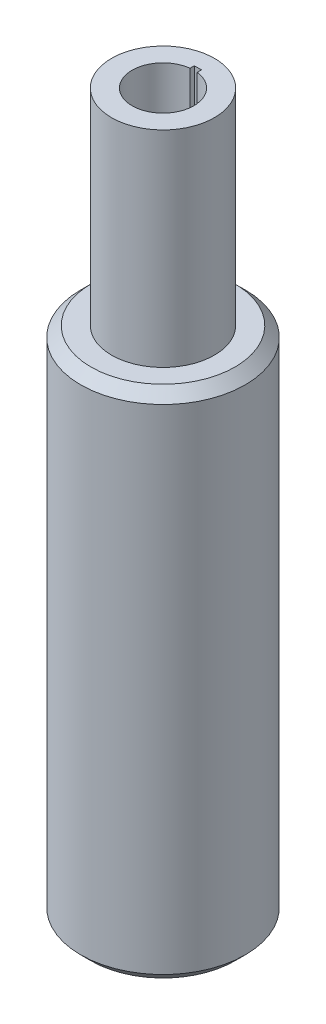
ISO-10303-21;
HEADER;
FILE_DESCRIPTION(('STEP AP214'),'2;1');
FILE_NAME('part.step','',(''),(''),'','','');
FILE_SCHEMA(('AUTOMOTIVE_DESIGN { 1 0 10303 214 1 1 1 1 }'));
ENDSEC;
DATA;
#1=APPLICATION_CONTEXT('core data for automotive mechanical design processes');
#2=APPLICATION_PROTOCOL_DEFINITION('international standard','automotive_design',2000,#1);
#3=PRODUCT_CONTEXT('',#1,'mechanical');
#4=PRODUCT('Part','Part','',(#3));
#5=PRODUCT_RELATED_PRODUCT_CATEGORY('part','',(#4));
#6=PRODUCT_DEFINITION_FORMATION('','',#4);
#7=PRODUCT_DEFINITION_CONTEXT('part definition',#1,'design');
#8=PRODUCT_DEFINITION('design','',#6,#7);
#9=PRODUCT_DEFINITION_SHAPE('','',#8);
#10=(LENGTH_UNIT() NAMED_UNIT(*) SI_UNIT(.MILLI.,.METRE.));
#11=(NAMED_UNIT(*) PLANE_ANGLE_UNIT() SI_UNIT($,.RADIAN.));
#12=(NAMED_UNIT(*) SI_UNIT($,.STERADIAN.) SOLID_ANGLE_UNIT());
#13=UNCERTAINTY_MEASURE_WITH_UNIT(LENGTH_MEASURE(1.E-05),#10,'distance_accuracy_value','');
#14=(GEOMETRIC_REPRESENTATION_CONTEXT(3) GLOBAL_UNCERTAINTY_ASSIGNED_CONTEXT((#13)) GLOBAL_UNIT_ASSIGNED_CONTEXT((#10,
#11,#12)) REPRESENTATION_CONTEXT('',''));
#15=CARTESIAN_POINT('',(0.,0.,0.));
#16=DIRECTION('',(0.,0.,1.));
#17=DIRECTION('',(1.,0.,0.));
#18=AXIS2_PLACEMENT_3D('',#15,#16,#17);
#19=CARTESIAN_POINT('',(0.,25.,0.));
#20=DIRECTION('',(0.,1.,0.));
#21=DIRECTION('',(0.,0.,1.));
#22=AXIS2_PLACEMENT_3D('',#19,#20,#21);
#23=PLANE('',#22);
#24=CARTESIAN_POINT('',(0.,25.,0.));
#25=DIRECTION('',(0.,1.,0.));
#26=DIRECTION('',(0.,0.,1.));
#27=AXIS2_PLACEMENT_3D('',#24,#25,#26);
#28=CIRCLE('',#27,3.50000000000001);
#29=CARTESIAN_POINT('',(0.,25.,3.50000000000001));
#30=VERTEX_POINT('',#29);
#31=EDGE_CURVE('E122',#30,#30,#28,.T.);
#32=ORIENTED_EDGE('',*,*,#31,.T.);
#33=EDGE_LOOP('',(#32));
#34=FACE_BOUND('',#33,.T.);
#35=CARTESIAN_POINT('',(0.,25.,0.));
#36=DIRECTION('',(0.,1.,0.));
#37=DIRECTION('',(0.,0.,1.));
#38=AXIS2_PLACEMENT_3D('',#35,#36,#37);
#39=CIRCLE('',#38,2.5);
#40=CARTESIAN_POINT('',(0.,25.,2.5));
#41=VERTEX_POINT('',#40);
#42=EDGE_CURVE('E97',#41,#41,#39,.T.);
#43=ORIENTED_EDGE('',*,*,#42,.F.);
#44=EDGE_LOOP('',(#43));
#45=FACE_BOUND('',#44,.T.);
#46=ADVANCED_FACE('F41',(#34,#45),#23,.T.);
#47=CARTESIAN_POINT('',(0.,25.,0.));
#48=DIRECTION('',(0.,-1.,0.));
#49=DIRECTION('',(0.,0.,-1.));
#50=AXIS2_PLACEMENT_3D('',#47,#48,#49);
#51=CYLINDRICAL_SURFACE('',#50,4.);
#52=CARTESIAN_POINT('',(0.,0.500000000000011,0.));
#53=DIRECTION('',(0.,1.,0.));
#54=DIRECTION('',(0.,0.,1.));
#55=AXIS2_PLACEMENT_3D('',#52,#53,#54);
#56=CIRCLE('',#55,4.);
#57=CARTESIAN_POINT('',(0.,0.500000000000011,4.));
#58=VERTEX_POINT('',#57);
#59=EDGE_CURVE('E50',#58,#58,#56,.T.);
#60=ORIENTED_EDGE('',*,*,#59,.T.);
#61=EDGE_LOOP('',(#60));
#62=FACE_BOUND('',#61,.T.);
#63=CARTESIAN_POINT('',(0.,24.5,0.));
#64=DIRECTION('',(0.,1.,0.));
#65=DIRECTION('',(0.,0.,1.));
#66=AXIS2_PLACEMENT_3D('',#63,#64,#65);
#67=CIRCLE('',#66,4.);
#68=CARTESIAN_POINT('',(0.,24.5,4.));
#69=VERTEX_POINT('',#68);
#70=EDGE_CURVE('E127',#69,#69,#67,.F.);
#71=ORIENTED_EDGE('',*,*,#70,.T.);
#72=EDGE_LOOP('',(#71));
#73=FACE_BOUND('',#72,.T.);
#74=ADVANCED_FACE('F132',(#62,#73),#51,.T.);
#75=CARTESIAN_POINT('',(0.,0.,0.));
#76=DIRECTION('',(0.,1.,0.));
#77=DIRECTION('',(0.,0.,1.));
#78=AXIS2_PLACEMENT_3D('',#75,#76,#77);
#79=PLANE('',#78);
#80=CARTESIAN_POINT('',(0.,0.,0.));
#81=DIRECTION('',(0.,1.,0.));
#82=DIRECTION('',(0.,0.,1.));
#83=AXIS2_PLACEMENT_3D('',#80,#81,#82);
#84=CIRCLE('',#83,3.49999999999999);
#85=CARTESIAN_POINT('',(0.,0.,3.49999999999999));
#86=VERTEX_POINT('',#85);
#87=EDGE_CURVE('E11',#86,#86,#84,.F.);
#88=ORIENTED_EDGE('',*,*,#87,.T.);
#89=EDGE_LOOP('',(#88));
#90=FACE_BOUND('',#89,.T.);
#91=ADVANCED_FACE('F152',(#90),#79,.F.);
#92=CARTESIAN_POINT('',(0.,35.,0.));
#93=DIRECTION('',(0.,1.,0.));
#94=DIRECTION('',(0.,0.,1.));
#95=AXIS2_PLACEMENT_3D('',#92,#93,#94);
#96=PLANE('',#95);
#97=CARTESIAN_POINT('',(0.,35.,0.));
#98=DIRECTION('',(0.,1.,0.));
#99=DIRECTION('',(0.,0.,1.));
#100=AXIS2_PLACEMENT_3D('',#97,#98,#99);
#101=CIRCLE('',#100,2.5);
#102=CARTESIAN_POINT('',(0.,35.,2.5));
#103=VERTEX_POINT('',#102);
#104=EDGE_CURVE('E119',#103,#103,#101,.T.);
#105=ORIENTED_EDGE('',*,*,#104,.T.);
#106=EDGE_LOOP('',(#105));
#107=FACE_BOUND('',#106,.T.);
#108=DIRECTION('',(0.,0.,-1.));
#109=VECTOR('',#108,1.);
#110=CARTESIAN_POINT('',(0.175,35.,-1.69795370154396));
#111=LINE('',#110,#109);
#112=CARTESIAN_POINT('',(0.175,35.,-1.48975669154396));
#113=VERTEX_POINT('',#112);
#114=CARTESIAN_POINT('',(0.175,35.,-1.69795370154396));
#115=VERTEX_POINT('',#114);
#116=EDGE_CURVE('E91',#113,#115,#111,.T.);
#117=ORIENTED_EDGE('',*,*,#116,.F.);
#118=CARTESIAN_POINT('',(0.,35.,0.));
#119=DIRECTION('',(0.,1.,0.));
#120=DIRECTION('',(0.,0.,1.));
#121=AXIS2_PLACEMENT_3D('',#118,#119,#120);
#122=CIRCLE('',#121,1.5);
#123=CARTESIAN_POINT('',(-0.175,35.,-1.48975669154396));
#124=VERTEX_POINT('',#123);
#125=EDGE_CURVE('E82',#124,#113,#122,.T.);
#126=ORIENTED_EDGE('',*,*,#125,.F.);
#127=DIRECTION('',(0.,0.,1.));
#128=VECTOR('',#127,1.);
#129=CARTESIAN_POINT('',(-0.175,35.,-1.48975669154396));
#130=LINE('',#129,#128);
#131=CARTESIAN_POINT('',(-0.175,35.,-1.69795370154396));
#132=VERTEX_POINT('',#131);
#133=EDGE_CURVE('E105',#132,#124,#130,.T.);
#134=ORIENTED_EDGE('',*,*,#133,.F.);
#135=DIRECTION('',(-1.,0.,0.));
#136=VECTOR('',#135,1.);
#137=CARTESIAN_POINT('',(-0.175,35.,-1.69795370154396));
#138=LINE('',#137,#136);
#139=EDGE_CURVE('E103',#115,#132,#138,.T.);
#140=ORIENTED_EDGE('',*,*,#139,.F.);
#141=EDGE_LOOP('',(#117,#126,#134,#140));
#142=FACE_BOUND('',#141,.T.);
#143=ADVANCED_FACE('F101',(#107,#142),#96,.T.);
#144=CARTESIAN_POINT('',(0.,35.,0.));
#145=DIRECTION('',(0.,-1.,0.));
#146=DIRECTION('',(0.,0.,-1.));
#147=AXIS2_PLACEMENT_3D('',#144,#145,#146);
#148=CYLINDRICAL_SURFACE('',#147,2.5);
#149=ORIENTED_EDGE('',*,*,#104,.F.);
#150=EDGE_LOOP('',(#149));
#151=FACE_BOUND('',#150,.T.);
#152=ORIENTED_EDGE('',*,*,#42,.T.);
#153=EDGE_LOOP('',(#152));
#154=FACE_BOUND('',#153,.T.);
#155=ADVANCED_FACE('F175',(#151,#154),#148,.T.);
#156=CARTESIAN_POINT('',(0.,35.,0.));
#157=DIRECTION('',(0.,-1.,0.));
#158=DIRECTION('',(0.,0.,-1.));
#159=AXIS2_PLACEMENT_3D('',#156,#157,#158);
#160=CYLINDRICAL_SURFACE('',#159,1.5);
#161=CARTESIAN_POINT('',(0.,25.,0.));
#162=DIRECTION('',(0.,1.,0.));
#163=DIRECTION('',(0.,0.,1.));
#164=AXIS2_PLACEMENT_3D('',#161,#162,#163);
#165=CIRCLE('',#164,1.5);
#166=CARTESIAN_POINT('',(-0.175,25.,-1.48975669154396));
#167=VERTEX_POINT('',#166);
#168=CARTESIAN_POINT('',(0.175,25.,-1.48975669154396));
#169=VERTEX_POINT('',#168);
#170=EDGE_CURVE('E57',#167,#169,#165,.T.);
#171=ORIENTED_EDGE('',*,*,#170,.F.);
#172=DIRECTION('',(0.,-1.,0.));
#173=VECTOR('',#172,1.);
#174=CARTESIAN_POINT('',(-0.175,35.,-1.48975669154396));
#175=LINE('',#174,#173);
#176=EDGE_CURVE('E87',#124,#167,#175,.T.);
#177=ORIENTED_EDGE('',*,*,#176,.F.);
#178=ORIENTED_EDGE('',*,*,#125,.T.);
#179=DIRECTION('',(0.,-1.,0.));
#180=VECTOR('',#179,1.);
#181=CARTESIAN_POINT('',(0.175,35.,-1.48975669154396));
#182=LINE('',#181,#180);
#183=EDGE_CURVE('E85',#113,#169,#182,.T.);
#184=ORIENTED_EDGE('',*,*,#183,.T.);
#185=EDGE_LOOP('',(#171,#177,#178,#184));
#186=FACE_BOUND('',#185,.T.);
#187=ADVANCED_FACE('F84',(#186),#160,.F.);
#188=CARTESIAN_POINT('',(0.175,35.,-1.69795370154396));
#189=DIRECTION('',(-1.,0.,0.));
#190=DIRECTION('',(0.,0.,1.));
#191=AXIS2_PLACEMENT_3D('',#188,#189,#190);
#192=PLANE('',#191);
#193=DIRECTION('',(0.,0.,-1.));
#194=VECTOR('',#193,1.);
#195=CARTESIAN_POINT('',(0.175,25.,-1.69795370154396));
#196=LINE('',#195,#194);
#197=CARTESIAN_POINT('',(0.175,25.,-1.69795370154396));
#198=VERTEX_POINT('',#197);
#199=EDGE_CURVE('E61',#169,#198,#196,.T.);
#200=ORIENTED_EDGE('',*,*,#199,.F.);
#201=ORIENTED_EDGE('',*,*,#183,.F.);
#202=ORIENTED_EDGE('',*,*,#116,.T.);
#203=DIRECTION('',(0.,-1.,0.));
#204=VECTOR('',#203,1.);
#205=CARTESIAN_POINT('',(0.175,35.,-1.69795370154396));
#206=LINE('',#205,#204);
#207=EDGE_CURVE('E98',#115,#198,#206,.T.);
#208=ORIENTED_EDGE('',*,*,#207,.T.);
#209=EDGE_LOOP('',(#200,#201,#202,#208));
#210=FACE_BOUND('',#209,.T.);
#211=ADVANCED_FACE('F95',(#210),#192,.T.);
#212=CARTESIAN_POINT('',(-0.175,35.,-1.69795370154396));
#213=DIRECTION('',(0.,0.,1.));
#214=DIRECTION('',(1.,0.,0.));
#215=AXIS2_PLACEMENT_3D('',#212,#213,#214);
#216=PLANE('',#215);
#217=DIRECTION('',(-1.,0.,0.));
#218=VECTOR('',#217,1.);
#219=CARTESIAN_POINT('',(-0.175,25.,-1.69795370154396));
#220=LINE('',#219,#218);
#221=CARTESIAN_POINT('',(-0.175,25.,-1.69795370154396));
#222=VERTEX_POINT('',#221);
#223=EDGE_CURVE('E111',#198,#222,#220,.T.);
#224=ORIENTED_EDGE('',*,*,#223,.F.);
#225=ORIENTED_EDGE('',*,*,#207,.F.);
#226=ORIENTED_EDGE('',*,*,#139,.T.);
#227=DIRECTION('',(0.,-1.,0.));
#228=VECTOR('',#227,1.);
#229=CARTESIAN_POINT('',(-0.175,35.,-1.69795370154396));
#230=LINE('',#229,#228);
#231=EDGE_CURVE('E115',#132,#222,#230,.T.);
#232=ORIENTED_EDGE('',*,*,#231,.T.);
#233=EDGE_LOOP('',(#224,#225,#226,#232));
#234=FACE_BOUND('',#233,.T.);
#235=ADVANCED_FACE('F161',(#234),#216,.T.);
#236=CARTESIAN_POINT('',(-0.175,35.,-1.48975669154396));
#237=DIRECTION('',(1.,0.,0.));
#238=DIRECTION('',(0.,0.,-1.));
#239=AXIS2_PLACEMENT_3D('',#236,#237,#238);
#240=PLANE('',#239);
#241=DIRECTION('',(0.,0.,1.));
#242=VECTOR('',#241,1.);
#243=CARTESIAN_POINT('',(-0.175,25.,-1.48975669154396));
#244=LINE('',#243,#242);
#245=EDGE_CURVE('E92',#222,#167,#244,.T.);
#246=ORIENTED_EDGE('',*,*,#245,.F.);
#247=ORIENTED_EDGE('',*,*,#231,.F.);
#248=ORIENTED_EDGE('',*,*,#133,.T.);
#249=ORIENTED_EDGE('',*,*,#176,.T.);
#250=EDGE_LOOP('',(#246,#247,#248,#249));
#251=FACE_BOUND('',#250,.T.);
#252=ADVANCED_FACE('F157',(#251),#240,.T.);
#253=ORIENTED_EDGE('',*,*,#170,.T.);
#254=ORIENTED_EDGE('',*,*,#199,.T.);
#255=ORIENTED_EDGE('',*,*,#223,.T.);
#256=ORIENTED_EDGE('',*,*,#245,.T.);
#257=EDGE_LOOP('',(#253,#254,#255,#256));
#258=FACE_BOUND('',#257,.T.);
#259=ADVANCED_FACE('F142',(#258),#23,.T.);
#260=CARTESIAN_POINT('',(0.,25.,0.));
#261=DIRECTION('',(0.,-1.,0.));
#262=DIRECTION('',(0.,0.,-1.));
#263=AXIS2_PLACEMENT_3D('',#260,#261,#262);
#264=CONICAL_SURFACE('',#263,3.50000000000001,0.785398163397445);
#265=ORIENTED_EDGE('',*,*,#70,.F.);
#266=EDGE_LOOP('',(#265));
#267=FACE_BOUND('',#266,.T.);
#268=ORIENTED_EDGE('',*,*,#31,.F.);
#269=EDGE_LOOP('',(#268));
#270=FACE_BOUND('',#269,.T.);
#271=ADVANCED_FACE('F136',(#267,#270),#264,.T.);
#272=CARTESIAN_POINT('',(0.,0.500000000000011,0.));
#273=DIRECTION('',(0.,1.,0.));
#274=DIRECTION('',(0.,0.,1.));
#275=AXIS2_PLACEMENT_3D('',#272,#273,#274);
#276=CONICAL_SURFACE('',#275,4.,0.785398163397448);
#277=ORIENTED_EDGE('',*,*,#87,.F.);
#278=EDGE_LOOP('',(#277));
#279=FACE_BOUND('',#278,.T.);
#280=ORIENTED_EDGE('',*,*,#59,.F.);
#281=EDGE_LOOP('',(#280));
#282=FACE_BOUND('',#281,.T.);
#283=ADVANCED_FACE('F44',(#279,#282),#276,.T.);
#284=CLOSED_SHELL('',(#46,#74,#91,#143,#155,#187,#211,#235,#252,#259,#271,#283));
#285=MANIFOLD_SOLID_BREP('B2',#284);
#286=ADVANCED_BREP_SHAPE_REPRESENTATION('',(#18,#285),#14);
#287=SHAPE_DEFINITION_REPRESENTATION(#9,#286);
ENDSEC;
END-ISO-10303-21;
